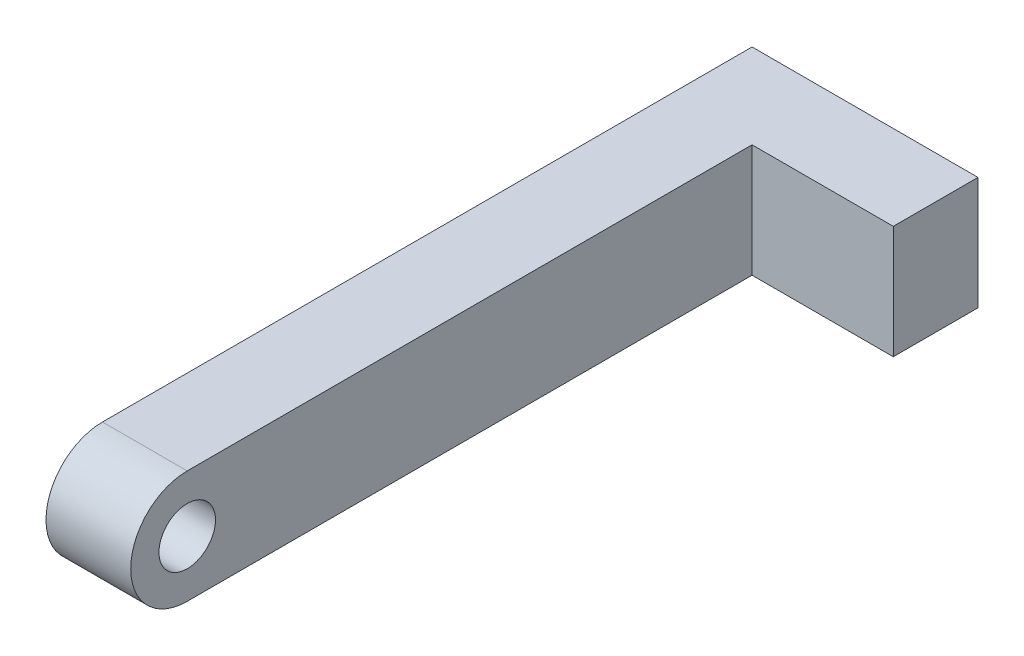
ISO-10303-21;
HEADER;
FILE_DESCRIPTION(('STEP AP214'),'2;1');
FILE_NAME('part.step','',(''),(''),'','','');
FILE_SCHEMA(('AUTOMOTIVE_DESIGN { 1 0 10303 214 1 1 1 1 }'));
ENDSEC;
DATA;
#1=APPLICATION_CONTEXT('core data for automotive mechanical design processes');
#2=APPLICATION_PROTOCOL_DEFINITION('international standard','automotive_design',2000,#1);
#3=PRODUCT_CONTEXT('',#1,'mechanical');
#4=PRODUCT('Part','Part','',(#3));
#5=PRODUCT_RELATED_PRODUCT_CATEGORY('part','',(#4));
#6=PRODUCT_DEFINITION_FORMATION('','',#4);
#7=PRODUCT_DEFINITION_CONTEXT('part definition',#1,'design');
#8=PRODUCT_DEFINITION('design','',#6,#7);
#9=PRODUCT_DEFINITION_SHAPE('','',#8);
#10=(LENGTH_UNIT() NAMED_UNIT(*) SI_UNIT(.MILLI.,.METRE.));
#11=(NAMED_UNIT(*) PLANE_ANGLE_UNIT() SI_UNIT($,.RADIAN.));
#12=(NAMED_UNIT(*) SI_UNIT($,.STERADIAN.) SOLID_ANGLE_UNIT());
#13=UNCERTAINTY_MEASURE_WITH_UNIT(LENGTH_MEASURE(1.E-05),#10,'distance_accuracy_value','');
#14=(GEOMETRIC_REPRESENTATION_CONTEXT(3) GLOBAL_UNCERTAINTY_ASSIGNED_CONTEXT((#13)) GLOBAL_UNIT_ASSIGNED_CONTEXT((#10,
#11,#12)) REPRESENTATION_CONTEXT('',''));
#15=CARTESIAN_POINT('',(0.,0.,0.));
#16=DIRECTION('',(0.,0.,1.));
#17=DIRECTION('',(1.,0.,0.));
#18=AXIS2_PLACEMENT_3D('',#15,#16,#17);
#19=CARTESIAN_POINT('',(6.,4.,0.));
#20=DIRECTION('',(0.,1.,0.));
#21=DIRECTION('',(0.,0.,1.));
#22=AXIS2_PLACEMENT_3D('',#19,#20,#21);
#23=PLANE('',#22);
#24=DIRECTION('',(0.,0.,-1.));
#25=VECTOR('',#24,1.);
#26=CARTESIAN_POINT('',(0.,4.,0.));
#27=LINE('',#26,#25);
#28=CARTESIAN_POINT('',(0.,4.,0.));
#29=VERTEX_POINT('',#28);
#30=CARTESIAN_POINT('',(0.,4.,-46.));
#31=VERTEX_POINT('',#30);
#32=EDGE_CURVE('E80',#29,#31,#27,.T.);
#33=ORIENTED_EDGE('',*,*,#32,.F.);
#34=DIRECTION('',(-1.,0.,0.));
#35=VECTOR('',#34,1.);
#36=CARTESIAN_POINT('',(6.,4.,0.));
#37=LINE('',#36,#35);
#38=CARTESIAN_POINT('',(6.,4.,0.));
#39=VERTEX_POINT('',#38);
#40=EDGE_CURVE('E11',#39,#29,#37,.T.);
#41=ORIENTED_EDGE('',*,*,#40,.F.);
#42=DIRECTION('',(0.,0.,-1.));
#43=VECTOR('',#42,1.);
#44=CARTESIAN_POINT('',(6.,4.,0.));
#45=LINE('',#44,#43);
#46=CARTESIAN_POINT('',(6.,4.,-40.));
#47=VERTEX_POINT('',#46);
#48=EDGE_CURVE('E115',#39,#47,#45,.T.);
#49=ORIENTED_EDGE('',*,*,#48,.T.);
#50=DIRECTION('',(-1.,0.,0.));
#51=VECTOR('',#50,1.);
#52=CARTESIAN_POINT('',(16.,4.,-40.));
#53=LINE('',#52,#51);
#54=CARTESIAN_POINT('',(16.,4.,-40.));
#55=VERTEX_POINT('',#54);
#56=EDGE_CURVE('E104',#55,#47,#53,.T.);
#57=ORIENTED_EDGE('',*,*,#56,.F.);
#58=DIRECTION('',(0.,0.,1.));
#59=VECTOR('',#58,1.);
#60=CARTESIAN_POINT('',(16.,4.,-40.));
#61=LINE('',#60,#59);
#62=CARTESIAN_POINT('',(16.,4.,-46.));
#63=VERTEX_POINT('',#62);
#64=EDGE_CURVE('E83',#63,#55,#61,.T.);
#65=ORIENTED_EDGE('',*,*,#64,.F.);
#66=DIRECTION('',(-1.,0.,0.));
#67=VECTOR('',#66,1.);
#68=CARTESIAN_POINT('',(6.,4.,-46.));
#69=LINE('',#68,#67);
#70=EDGE_CURVE('E77',#63,#31,#69,.T.);
#71=ORIENTED_EDGE('',*,*,#70,.T.);
#72=EDGE_LOOP('',(#33,#41,#49,#57,#65,#71));
#73=FACE_BOUND('',#72,.T.);
#74=ADVANCED_FACE('F37',(#73),#23,.T.);
#75=CARTESIAN_POINT('',(6.,0.,0.));
#76=DIRECTION('',(-1.,0.,0.));
#77=DIRECTION('',(0.,0.,1.));
#78=AXIS2_PLACEMENT_3D('',#75,#76,#77);
#79=CYLINDRICAL_SURFACE('',#78,4.);
#80=CARTESIAN_POINT('',(0.,0.,0.));
#81=DIRECTION('',(1.,0.,0.));
#82=DIRECTION('',(0.,0.,-1.));
#83=AXIS2_PLACEMENT_3D('',#80,#81,#82);
#84=CIRCLE('',#83,4.);
#85=CARTESIAN_POINT('',(0.,-4.,0.));
#86=VERTEX_POINT('',#85);
#87=EDGE_CURVE('E103',#29,#86,#84,.T.);
#88=ORIENTED_EDGE('',*,*,#87,.T.);
#89=DIRECTION('',(-1.,0.,0.));
#90=VECTOR('',#89,1.);
#91=CARTESIAN_POINT('',(6.,-4.,0.));
#92=LINE('',#91,#90);
#93=CARTESIAN_POINT('',(6.,-4.,0.));
#94=VERTEX_POINT('',#93);
#95=EDGE_CURVE('E44',#94,#86,#92,.T.);
#96=ORIENTED_EDGE('',*,*,#95,.F.);
#97=CARTESIAN_POINT('',(6.,0.,0.));
#98=DIRECTION('',(1.,0.,0.));
#99=DIRECTION('',(0.,0.,-1.));
#100=AXIS2_PLACEMENT_3D('',#97,#98,#99);
#101=CIRCLE('',#100,4.);
#102=EDGE_CURVE('E57',#39,#94,#101,.T.);
#103=ORIENTED_EDGE('',*,*,#102,.F.);
#104=ORIENTED_EDGE('',*,*,#40,.T.);
#105=EDGE_LOOP('',(#88,#96,#103,#104));
#106=FACE_BOUND('',#105,.T.);
#107=ADVANCED_FACE('F124',(#106),#79,.T.);
#108=CARTESIAN_POINT('',(6.,-4.,0.));
#109=DIRECTION('',(0.,1.,0.));
#110=DIRECTION('',(0.,0.,1.));
#111=AXIS2_PLACEMENT_3D('',#108,#109,#110);
#112=PLANE('',#111);
#113=DIRECTION('',(0.,0.,-1.));
#114=VECTOR('',#113,1.);
#115=CARTESIAN_POINT('',(0.,-4.,0.));
#116=LINE('',#115,#114);
#117=CARTESIAN_POINT('',(0.,-4.,-46.));
#118=VERTEX_POINT('',#117);
#119=EDGE_CURVE('E98',#86,#118,#116,.T.);
#120=ORIENTED_EDGE('',*,*,#119,.T.);
#121=DIRECTION('',(-1.,0.,0.));
#122=VECTOR('',#121,1.);
#123=CARTESIAN_POINT('',(6.,-4.,-46.));
#124=LINE('',#123,#122);
#125=CARTESIAN_POINT('',(16.,-4.,-46.));
#126=VERTEX_POINT('',#125);
#127=EDGE_CURVE('E87',#126,#118,#124,.T.);
#128=ORIENTED_EDGE('',*,*,#127,.F.);
#129=DIRECTION('',(0.,0.,-1.));
#130=VECTOR('',#129,1.);
#131=CARTESIAN_POINT('',(16.,-4.,-46.));
#132=LINE('',#131,#130);
#133=CARTESIAN_POINT('',(16.,-4.,-40.));
#134=VERTEX_POINT('',#133);
#135=EDGE_CURVE('E139',#134,#126,#132,.T.);
#136=ORIENTED_EDGE('',*,*,#135,.F.);
#137=DIRECTION('',(-1.,0.,0.));
#138=VECTOR('',#137,1.);
#139=CARTESIAN_POINT('',(16.,-4.,-40.));
#140=LINE('',#139,#138);
#141=CARTESIAN_POINT('',(6.,-4.,-40.));
#142=VERTEX_POINT('',#141);
#143=EDGE_CURVE('E108',#134,#142,#140,.T.);
#144=ORIENTED_EDGE('',*,*,#143,.T.);
#145=DIRECTION('',(0.,0.,-1.));
#146=VECTOR('',#145,1.);
#147=CARTESIAN_POINT('',(6.,-4.,0.));
#148=LINE('',#147,#146);
#149=EDGE_CURVE('E122',#94,#142,#148,.T.);
#150=ORIENTED_EDGE('',*,*,#149,.F.);
#151=ORIENTED_EDGE('',*,*,#95,.T.);
#152=EDGE_LOOP('',(#120,#128,#136,#144,#150,#151));
#153=FACE_BOUND('',#152,.T.);
#154=ADVANCED_FACE('F120',(#153),#112,.F.);
#155=CARTESIAN_POINT('',(6.,0.,-46.));
#156=DIRECTION('',(0.,0.,1.));
#157=DIRECTION('',(1.,0.,0.));
#158=AXIS2_PLACEMENT_3D('',#155,#156,#157);
#159=PLANE('',#158);
#160=DIRECTION('',(0.,1.,0.));
#161=VECTOR('',#160,1.);
#162=CARTESIAN_POINT('',(0.,0.,-46.));
#163=LINE('',#162,#161);
#164=EDGE_CURVE('E92',#118,#31,#163,.T.);
#165=ORIENTED_EDGE('',*,*,#164,.T.);
#166=ORIENTED_EDGE('',*,*,#70,.F.);
#167=DIRECTION('',(0.,1.,0.));
#168=VECTOR('',#167,1.);
#169=CARTESIAN_POINT('',(16.,4.,-46.));
#170=LINE('',#169,#168);
#171=EDGE_CURVE('E142',#126,#63,#170,.T.);
#172=ORIENTED_EDGE('',*,*,#171,.F.);
#173=ORIENTED_EDGE('',*,*,#127,.T.);
#174=EDGE_LOOP('',(#165,#166,#172,#173));
#175=FACE_BOUND('',#174,.T.);
#176=ADVANCED_FACE('F93',(#175),#159,.F.);
#177=CARTESIAN_POINT('',(6.,0.,0.));
#178=DIRECTION('',(-1.,0.,0.));
#179=DIRECTION('',(0.,0.,1.));
#180=AXIS2_PLACEMENT_3D('',#177,#178,#179);
#181=CYLINDRICAL_SURFACE('',#180,2.);
#182=CARTESIAN_POINT('',(6.,0.,0.));
#183=DIRECTION('',(1.,0.,0.));
#184=DIRECTION('',(0.,0.,-1.));
#185=AXIS2_PLACEMENT_3D('',#182,#183,#184);
#186=CIRCLE('',#185,2.);
#187=CARTESIAN_POINT('',(6.,0.,-2.));
#188=VERTEX_POINT('',#187);
#189=EDGE_CURVE('E88',#188,#188,#186,.T.);
#190=ORIENTED_EDGE('',*,*,#189,.T.);
#191=EDGE_LOOP('',(#190));
#192=FACE_BOUND('',#191,.T.);
#193=CARTESIAN_POINT('',(0.,0.,0.));
#194=DIRECTION('',(1.,0.,0.));
#195=DIRECTION('',(0.,0.,-1.));
#196=AXIS2_PLACEMENT_3D('',#193,#194,#195);
#197=CIRCLE('',#196,2.);
#198=CARTESIAN_POINT('',(0.,0.,-2.));
#199=VERTEX_POINT('',#198);
#200=EDGE_CURVE('E97',#199,#199,#197,.T.);
#201=ORIENTED_EDGE('',*,*,#200,.F.);
#202=EDGE_LOOP('',(#201));
#203=FACE_BOUND('',#202,.T.);
#204=ADVANCED_FACE('F152',(#192,#203),#181,.F.);
#205=CARTESIAN_POINT('',(6.,0.,0.));
#206=DIRECTION('',(1.,0.,0.));
#207=DIRECTION('',(0.,0.,-1.));
#208=AXIS2_PLACEMENT_3D('',#205,#206,#207);
#209=PLANE('',#208);
#210=DIRECTION('',(0.,-1.,0.));
#211=VECTOR('',#210,1.);
#212=CARTESIAN_POINT('',(6.,-4.,-40.));
#213=LINE('',#212,#211);
#214=EDGE_CURVE('E51',#47,#142,#213,.T.);
#215=ORIENTED_EDGE('',*,*,#214,.F.);
#216=ORIENTED_EDGE('',*,*,#48,.F.);
#217=ORIENTED_EDGE('',*,*,#102,.T.);
#218=ORIENTED_EDGE('',*,*,#149,.T.);
#219=EDGE_LOOP('',(#215,#216,#217,#218));
#220=FACE_BOUND('',#219,.T.);
#221=ORIENTED_EDGE('',*,*,#189,.F.);
#222=EDGE_LOOP('',(#221));
#223=FACE_BOUND('',#222,.T.);
#224=ADVANCED_FACE('F155',(#220,#223),#209,.T.);
#225=CARTESIAN_POINT('',(0.,0.,0.));
#226=DIRECTION('',(1.,0.,0.));
#227=DIRECTION('',(0.,0.,-1.));
#228=AXIS2_PLACEMENT_3D('',#225,#226,#227);
#229=PLANE('',#228);
#230=ORIENTED_EDGE('',*,*,#32,.T.);
#231=ORIENTED_EDGE('',*,*,#164,.F.);
#232=ORIENTED_EDGE('',*,*,#119,.F.);
#233=ORIENTED_EDGE('',*,*,#87,.F.);
#234=EDGE_LOOP('',(#230,#231,#232,#233));
#235=FACE_BOUND('',#234,.T.);
#236=ORIENTED_EDGE('',*,*,#200,.T.);
#237=EDGE_LOOP('',(#236));
#238=FACE_BOUND('',#237,.T.);
#239=ADVANCED_FACE('F101',(#235,#238),#229,.F.);
#240=CARTESIAN_POINT('',(16.,-4.,-40.));
#241=DIRECTION('',(0.,0.,-1.));
#242=DIRECTION('',(-1.,0.,0.));
#243=AXIS2_PLACEMENT_3D('',#240,#241,#242);
#244=PLANE('',#243);
#245=ORIENTED_EDGE('',*,*,#214,.T.);
#246=ORIENTED_EDGE('',*,*,#143,.F.);
#247=DIRECTION('',(0.,-1.,0.));
#248=VECTOR('',#247,1.);
#249=CARTESIAN_POINT('',(16.,-4.,-40.));
#250=LINE('',#249,#248);
#251=EDGE_CURVE('E133',#55,#134,#250,.T.);
#252=ORIENTED_EDGE('',*,*,#251,.F.);
#253=ORIENTED_EDGE('',*,*,#56,.T.);
#254=EDGE_LOOP('',(#245,#246,#252,#253));
#255=FACE_BOUND('',#254,.T.);
#256=ADVANCED_FACE('F129',(#255),#244,.F.);
#257=CARTESIAN_POINT('',(16.,0.,0.));
#258=DIRECTION('',(-1.,0.,0.));
#259=DIRECTION('',(0.,0.,1.));
#260=AXIS2_PLACEMENT_3D('',#257,#258,#259);
#261=PLANE('',#260);
#262=ORIENTED_EDGE('',*,*,#64,.T.);
#263=ORIENTED_EDGE('',*,*,#251,.T.);
#264=ORIENTED_EDGE('',*,*,#135,.T.);
#265=ORIENTED_EDGE('',*,*,#171,.T.);
#266=EDGE_LOOP('',(#262,#263,#264,#265));
#267=FACE_BOUND('',#266,.T.);
#268=ADVANCED_FACE('F141',(#267),#261,.F.);
#269=CLOSED_SHELL('',(#74,#107,#154,#176,#204,#224,#239,#256,#268));
#270=MANIFOLD_SOLID_BREP('B2',#269);
#271=ADVANCED_BREP_SHAPE_REPRESENTATION('',(#18,#270),#14);
#272=SHAPE_DEFINITION_REPRESENTATION(#9,#271);
ENDSEC;
END-ISO-10303-21;
